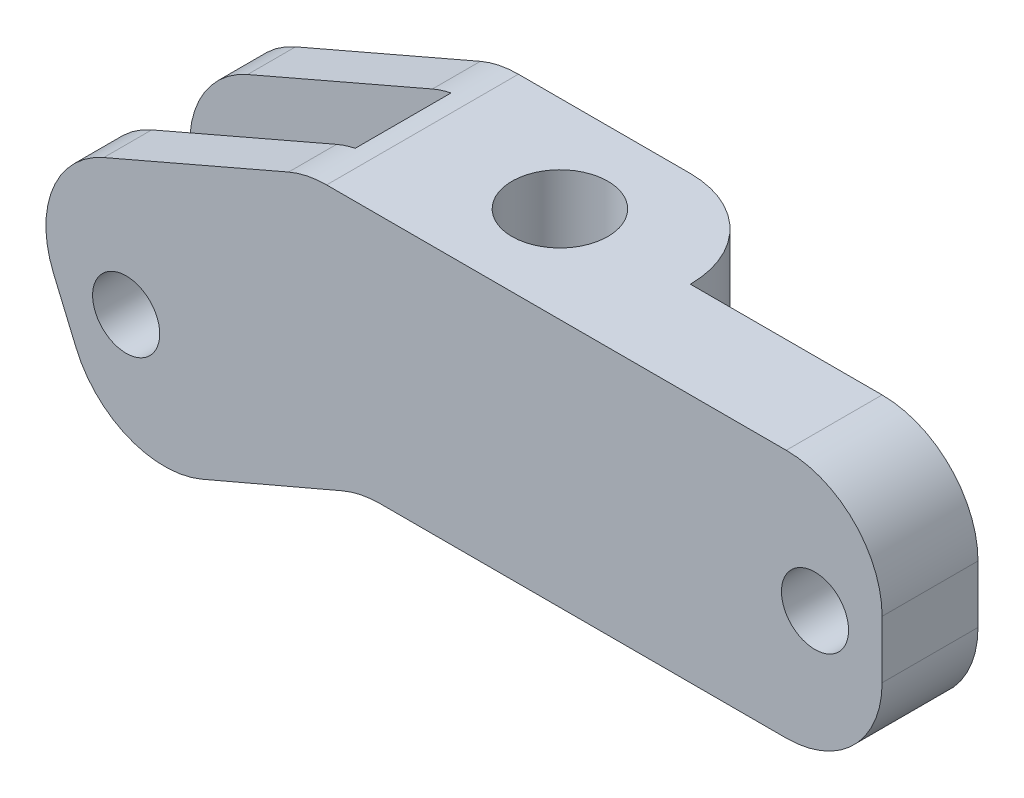
ISO-10303-21;
HEADER;
FILE_DESCRIPTION(('STEP AP214'),'2;1');
FILE_NAME('part.step','',(''),(''),'','','');
FILE_SCHEMA(('AUTOMOTIVE_DESIGN { 1 0 10303 214 1 1 1 1 }'));
ENDSEC;
DATA;
#1=APPLICATION_CONTEXT('core data for automotive mechanical design processes');
#2=APPLICATION_PROTOCOL_DEFINITION('international standard','automotive_design',2000,#1);
#3=PRODUCT_CONTEXT('',#1,'mechanical');
#4=PRODUCT('Part','Part','',(#3));
#5=PRODUCT_RELATED_PRODUCT_CATEGORY('part','',(#4));
#6=PRODUCT_DEFINITION_FORMATION('','',#4);
#7=PRODUCT_DEFINITION_CONTEXT('part definition',#1,'design');
#8=PRODUCT_DEFINITION('design','',#6,#7);
#9=PRODUCT_DEFINITION_SHAPE('','',#8);
#10=(LENGTH_UNIT() NAMED_UNIT(*) SI_UNIT(.MILLI.,.METRE.));
#11=(NAMED_UNIT(*) PLANE_ANGLE_UNIT() SI_UNIT($,.RADIAN.));
#12=(NAMED_UNIT(*) SI_UNIT($,.STERADIAN.) SOLID_ANGLE_UNIT());
#13=UNCERTAINTY_MEASURE_WITH_UNIT(LENGTH_MEASURE(1.E-05),#10,'distance_accuracy_value','');
#14=(GEOMETRIC_REPRESENTATION_CONTEXT(3) GLOBAL_UNCERTAINTY_ASSIGNED_CONTEXT((#13)) GLOBAL_UNIT_ASSIGNED_CONTEXT((#10,
#11,#12)) REPRESENTATION_CONTEXT('',''));
#15=CARTESIAN_POINT('',(0.,0.,0.));
#16=DIRECTION('',(0.,0.,1.));
#17=DIRECTION('',(1.,0.,0.));
#18=AXIS2_PLACEMENT_3D('',#15,#16,#17);
#19=CARTESIAN_POINT('',(-5.8701862452043,1.54429302734608,10.));
#20=DIRECTION('',(0.,0.,-1.));
#21=DIRECTION('',(-1.,0.,0.));
#22=AXIS2_PLACEMENT_3D('',#19,#20,#21);
#23=CYLINDRICAL_SURFACE('',#22,5.);
#24=DIRECTION('',(0.,0.,-1.));
#25=VECTOR('',#24,1.);
#26=CARTESIAN_POINT('',(-6.88194855886884,6.4408568246072,10.));
#27=LINE('',#26,#25);
#28=CARTESIAN_POINT('',(-6.88194855886884,6.4408568246072,7.5));
#29=VERTEX_POINT('',#28);
#30=CARTESIAN_POINT('',(-6.88194855886884,6.4408568246072,2.5));
#31=VERTEX_POINT('',#30);
#32=EDGE_CURVE('E354',#29,#31,#27,.T.);
#33=ORIENTED_EDGE('',*,*,#32,.F.);
#34=CARTESIAN_POINT('',(-5.8701862452043,1.54429302734608,7.5));
#35=DIRECTION('',(0.,0.,1.));
#36=DIRECTION('',(1.,0.,0.));
#37=AXIS2_PLACEMENT_3D('',#34,#35,#36);
#38=CIRCLE('',#37,5.);
#39=CARTESIAN_POINT('',(-7.85344478840631,6.1341389453281,7.5));
#40=VERTEX_POINT('',#39);
#41=EDGE_CURVE('E231',#40,#29,#38,.F.);
#42=ORIENTED_EDGE('',*,*,#41,.F.);
#43=DIRECTION('',(0.,0.,-1.));
#44=VECTOR('',#43,1.);
#45=CARTESIAN_POINT('',(-7.85344478840632,6.1341389453281,10.));
#46=LINE('',#45,#44);
#47=CARTESIAN_POINT('',(-7.85344478840632,6.1341389453281,10.));
#48=VERTEX_POINT('',#47);
#49=EDGE_CURVE('E343',#48,#40,#46,.T.);
#50=ORIENTED_EDGE('',*,*,#49,.F.);
#51=CARTESIAN_POINT('',(-5.8701862452043,1.54429302734608,10.));
#52=DIRECTION('',(0.,0.,-1.));
#53=DIRECTION('',(-1.,0.,0.));
#54=AXIS2_PLACEMENT_3D('',#51,#52,#53);
#55=CIRCLE('',#54,5.);
#56=CARTESIAN_POINT('',(-5.8701862452043,6.54429302734608,10.));
#57=VERTEX_POINT('',#56);
#58=EDGE_CURVE('E318',#57,#48,#55,.F.);
#59=ORIENTED_EDGE('',*,*,#58,.F.);
#60=DIRECTION('',(0.,0.,-1.));
#61=VECTOR('',#60,1.);
#62=CARTESIAN_POINT('',(-5.8701862452043,6.54429302734608,10.));
#63=LINE('',#62,#61);
#64=CARTESIAN_POINT('',(-5.8701862452043,6.54429302734608,0.));
#65=VERTEX_POINT('',#64);
#66=EDGE_CURVE('E337',#65,#57,#63,.F.);
#67=ORIENTED_EDGE('',*,*,#66,.F.);
#68=CARTESIAN_POINT('',(-5.8701862452043,1.54429302734608,0.));
#69=DIRECTION('',(0.,0.,-1.));
#70=DIRECTION('',(-1.,0.,0.));
#71=AXIS2_PLACEMENT_3D('',#68,#69,#70);
#72=CIRCLE('',#71,5.);
#73=CARTESIAN_POINT('',(-7.85344478840632,6.1341389453281,0.));
#74=VERTEX_POINT('',#73);
#75=EDGE_CURVE('E303',#74,#65,#72,.T.);
#76=ORIENTED_EDGE('',*,*,#75,.F.);
#77=CARTESIAN_POINT('',(-7.85344478840632,6.1341389453281,2.5));
#78=VERTEX_POINT('',#77);
#79=EDGE_CURVE('E342',#78,#74,#46,.T.);
#80=ORIENTED_EDGE('',*,*,#79,.F.);
#81=CARTESIAN_POINT('',(-5.8701862452043,1.54429302734608,2.5));
#82=DIRECTION('',(0.,0.,1.));
#83=DIRECTION('',(1.,0.,0.));
#84=AXIS2_PLACEMENT_3D('',#81,#82,#83);
#85=CIRCLE('',#84,5.);
#86=EDGE_CURVE('E356',#78,#31,#85,.F.);
#87=ORIENTED_EDGE('',*,*,#86,.T.);
#88=EDGE_LOOP('',(#33,#42,#50,#59,#67,#76,#80,#87));
#89=FACE_BOUND('',#88,.T.);
#90=ADVANCED_FACE('F35',(#89),#23,.T.);
#91=CARTESIAN_POINT('',(-6.9042271256126,6.54429302734608,10.));
#92=DIRECTION('',(0.396651708640403,-0.917969183596404,0.));
#93=DIRECTION('',(0.917969183596404,0.396651708640403,0.));
#94=AXIS2_PLACEMENT_3D('',#91,#92,#93);
#95=PLANE('',#94);
#96=DIRECTION('',(-0.917969183596404,-0.396651708640403,0.));
#97=VECTOR('',#96,1.);
#98=CARTESIAN_POINT('',(-22.0507186549533,-0.000460165220561928,2.5));
#99=LINE('',#98,#97);
#100=CARTESIAN_POINT('',(-17.4911673376097,1.96970817264501,2.5));
#101=VERTEX_POINT('',#100);
#102=EDGE_CURVE('E242',#78,#101,#99,.T.);
#103=ORIENTED_EDGE('',*,*,#102,.F.);
#104=ORIENTED_EDGE('',*,*,#79,.T.);
#105=DIRECTION('',(-0.917969183596404,-0.396651708640403,0.));
#106=VECTOR('',#105,1.);
#107=CARTESIAN_POINT('',(-6.9042271256126,6.54429302734608,0.));
#108=LINE('',#107,#106);
#109=CARTESIAN_POINT('',(-17.4911673376097,1.96970817264501,0.));
#110=VERTEX_POINT('',#109);
#111=EDGE_CURVE('E285',#74,#110,#108,.T.);
#112=ORIENTED_EDGE('',*,*,#111,.T.);
#113=DIRECTION('',(0.,0.,-1.));
#114=VECTOR('',#113,1.);
#115=CARTESIAN_POINT('',(-17.4911673376097,1.96970817264501,10.));
#116=LINE('',#115,#114);
#117=EDGE_CURVE('E347',#110,#101,#116,.F.);
#118=ORIENTED_EDGE('',*,*,#117,.T.);
#119=EDGE_LOOP('',(#103,#104,#112,#118));
#120=FACE_BOUND('',#119,.T.);
#121=ADVANCED_FACE('F432',(#120),#95,.F.);
#122=CARTESIAN_POINT('',(-22.0507186549533,-0.000460165220561928,10.));
#123=DIRECTION('',(0.920575736554109,0.390564096234998,0.));
#124=DIRECTION('',(-0.390564096234998,0.920575736554109,0.));
#125=AXIS2_PLACEMENT_3D('',#122,#123,#124);
#126=PLANE('',#125);
#127=DIRECTION('',(0.390564096234998,-0.920575736554108,0.));
#128=VECTOR('',#127,1.);
#129=CARTESIAN_POINT('',(-16.9733854038983,-11.967944740424,2.5));
#130=LINE('',#129,#128);
#131=CARTESIAN_POINT('',(-20.1107874771782,-4.57295822651201,2.5));
#132=VERTEX_POINT('',#131);
#133=CARTESIAN_POINT('',(-18.9329409445004,-7.34919124388369,2.5));
#134=VERTEX_POINT('',#133);
#135=EDGE_CURVE('E234',#132,#134,#130,.T.);
#136=ORIENTED_EDGE('',*,*,#135,.F.);
#137=DIRECTION('',(0.,0.,-1.));
#138=VECTOR('',#137,1.);
#139=CARTESIAN_POINT('',(-20.1107874771782,-4.572958226512,10.));
#140=LINE('',#139,#138);
#141=CARTESIAN_POINT('',(-20.1107874771782,-4.572958226512,0.));
#142=VERTEX_POINT('',#141);
#143=EDGE_CURVE('E310',#132,#142,#140,.T.);
#144=ORIENTED_EDGE('',*,*,#143,.T.);
#145=DIRECTION('',(0.390564096234998,-0.920575736554108,0.));
#146=VECTOR('',#145,1.);
#147=CARTESIAN_POINT('',(-22.0507186549533,-0.000460165220561928,0.));
#148=LINE('',#147,#146);
#149=CARTESIAN_POINT('',(-18.9329409445004,-7.34919124388369,0.));
#150=VERTEX_POINT('',#149);
#151=EDGE_CURVE('E288',#142,#150,#148,.T.);
#152=ORIENTED_EDGE('',*,*,#151,.T.);
#153=DIRECTION('',(0.,0.,-1.));
#154=VECTOR('',#153,1.);
#155=CARTESIAN_POINT('',(-18.9329409445004,-7.34919124388369,10.));
#156=LINE('',#155,#154);
#157=EDGE_CURVE('E315',#150,#134,#156,.F.);
#158=ORIENTED_EDGE('',*,*,#157,.T.);
#159=EDGE_LOOP('',(#136,#144,#152,#158));
#160=FACE_BOUND('',#159,.T.);
#161=ADVANCED_FACE('F436',(#160),#126,.F.);
#162=CARTESIAN_POINT('',(-4.1042271256126,-6.45570697265392,10.));
#163=DIRECTION('',(-0.393731269126432,0.919225591306122,0.));
#164=DIRECTION('',(-0.919225591306122,-0.393731269126432,0.));
#165=AXIS2_PLACEMENT_3D('',#162,#163,#164);
#166=PLANE('',#165);
#167=DIRECTION('',(0.919225591306122,0.393731269126432,0.));
#168=VECTOR('',#167,1.);
#169=CARTESIAN_POINT('',(-4.1042271256126,-6.45570697265392,2.5));
#170=LINE('',#169,#168);
#171=CARTESIAN_POINT('',(-12.3614059160977,-9.99249871923931,2.5));
#172=VERTEX_POINT('',#171);
#173=CARTESIAN_POINT('',(-5.04712789850232,-6.85957901612331,2.5));
#174=VERTEX_POINT('',#173);
#175=EDGE_CURVE('E238',#172,#174,#170,.T.);
#176=ORIENTED_EDGE('',*,*,#175,.F.);
#177=DIRECTION('',(0.,0.,-1.));
#178=VECTOR('',#177,1.);
#179=CARTESIAN_POINT('',(-12.3614059160977,-9.99249871923931,10.));
#180=LINE('',#179,#178);
#181=CARTESIAN_POINT('',(-12.3614059160977,-9.99249871923931,0.));
#182=VERTEX_POINT('',#181);
#183=EDGE_CURVE('E298',#172,#182,#180,.T.);
#184=ORIENTED_EDGE('',*,*,#183,.T.);
#185=DIRECTION('',(0.919225591306122,0.393731269126432,0.));
#186=VECTOR('',#185,1.);
#187=CARTESIAN_POINT('',(-4.1042271256126,-6.45570697265392,0.));
#188=LINE('',#187,#186);
#189=CARTESIAN_POINT('',(-5.04712789850232,-6.85957901612331,0.));
#190=VERTEX_POINT('',#189);
#191=EDGE_CURVE('E291',#182,#190,#188,.T.);
#192=ORIENTED_EDGE('',*,*,#191,.T.);
#193=DIRECTION('',(0.,0.,-1.));
#194=VECTOR('',#193,1.);
#195=CARTESIAN_POINT('',(-5.04712789850232,-6.85957901612331,10.));
#196=LINE('',#195,#194);
#197=EDGE_CURVE('E295',#190,#174,#196,.F.);
#198=ORIENTED_EDGE('',*,*,#197,.T.);
#199=EDGE_LOOP('',(#176,#184,#192,#198));
#200=FACE_BOUND('',#199,.T.);
#201=ADVANCED_FACE('F442',(#200),#166,.F.);
#202=CARTESIAN_POINT('',(-16.3238999645868,-4.53741159285459,10.));
#203=DIRECTION('',(0.,0.,-1.));
#204=DIRECTION('',(-1.,0.,0.));
#205=AXIS2_PLACEMENT_3D('',#202,#203,#204);
#206=CYLINDRICAL_SURFACE('',#205,1.75);
#207=CARTESIAN_POINT('',(-16.3238999645868,-4.53741159285459,0.));
#208=DIRECTION('',(0.,0.,1.));
#209=DIRECTION('',(1.,0.,0.));
#210=AXIS2_PLACEMENT_3D('',#207,#208,#209);
#211=CIRCLE('',#210,1.75);
#212=CARTESIAN_POINT('',(-14.5738999645868,-4.53741159285459,0.));
#213=VERTEX_POINT('',#212);
#214=EDGE_CURVE('E258',#213,#213,#211,.T.);
#215=ORIENTED_EDGE('',*,*,#214,.F.);
#216=EDGE_LOOP('',(#215));
#217=FACE_BOUND('',#216,.T.);
#218=CARTESIAN_POINT('',(-16.3238999645868,-4.53741159285459,2.5));
#219=DIRECTION('',(0.,0.,1.));
#220=DIRECTION('',(1.,0.,0.));
#221=AXIS2_PLACEMENT_3D('',#218,#219,#220);
#222=CIRCLE('',#221,1.75);
#223=CARTESIAN_POINT('',(-14.5738999645868,-4.53741159285459,2.5));
#224=VERTEX_POINT('',#223);
#225=EDGE_CURVE('E252',#224,#224,#222,.T.);
#226=ORIENTED_EDGE('',*,*,#225,.T.);
#227=EDGE_LOOP('',(#226));
#228=FACE_BOUND('',#227,.T.);
#229=ADVANCED_FACE('F573',(#217,#228),#206,.F.);
#230=CARTESIAN_POINT('',(-14.3300622617299,-5.3963707627087,10.));
#231=DIRECTION('',(0.,0.,-1.));
#232=DIRECTION('',(-1.,0.,0.));
#233=AXIS2_PLACEMENT_3D('',#230,#231,#232);
#234=CYLINDRICAL_SURFACE('',#233,5.);
#235=ORIENTED_EDGE('',*,*,#183,.F.);
#236=CARTESIAN_POINT('',(-14.3300622617299,-5.3963707627087,2.5));
#237=DIRECTION('',(0.,0.,1.));
#238=DIRECTION('',(1.,0.,0.));
#239=AXIS2_PLACEMENT_3D('',#236,#237,#238);
#240=CIRCLE('',#239,5.);
#241=EDGE_CURVE('E249',#172,#134,#240,.F.);
#242=ORIENTED_EDGE('',*,*,#241,.T.);
#243=ORIENTED_EDGE('',*,*,#157,.F.);
#244=CARTESIAN_POINT('',(-14.3300622617299,-5.3963707627087,0.));
#245=DIRECTION('',(0.,0.,-1.));
#246=DIRECTION('',(-1.,0.,0.));
#247=AXIS2_PLACEMENT_3D('',#244,#245,#246);
#248=CIRCLE('',#247,5.);
#249=EDGE_CURVE('E308',#182,#150,#248,.T.);
#250=ORIENTED_EDGE('',*,*,#249,.F.);
#251=EDGE_LOOP('',(#235,#242,#243,#250));
#252=FACE_BOUND('',#251,.T.);
#253=ADVANCED_FACE('F462',(#252),#234,.T.);
#254=CARTESIAN_POINT('',(-15.5079087944077,-2.62013774533702,10.));
#255=DIRECTION('',(0.,0.,-1.));
#256=DIRECTION('',(-1.,0.,0.));
#257=AXIS2_PLACEMENT_3D('',#254,#255,#256);
#258=CYLINDRICAL_SURFACE('',#257,5.);
#259=ORIENTED_EDGE('',*,*,#143,.F.);
#260=CARTESIAN_POINT('',(-15.5079087944077,-2.62013774533702,2.5));
#261=DIRECTION('',(0.,0.,1.));
#262=DIRECTION('',(1.,0.,0.));
#263=AXIS2_PLACEMENT_3D('',#260,#261,#262);
#264=CIRCLE('',#263,5.);
#265=EDGE_CURVE('E246',#132,#101,#264,.F.);
#266=ORIENTED_EDGE('',*,*,#265,.T.);
#267=ORIENTED_EDGE('',*,*,#117,.F.);
#268=CARTESIAN_POINT('',(-15.5079087944077,-2.62013774533702,0.));
#269=DIRECTION('',(0.,0.,-1.));
#270=DIRECTION('',(-1.,0.,0.));
#271=AXIS2_PLACEMENT_3D('',#268,#269,#270);
#272=CIRCLE('',#271,5.);
#273=EDGE_CURVE('E306',#142,#110,#272,.T.);
#274=ORIENTED_EDGE('',*,*,#273,.F.);
#275=EDGE_LOOP('',(#259,#266,#267,#274));
#276=FACE_BOUND('',#275,.T.);
#277=ADVANCED_FACE('F429',(#276),#258,.T.);
#278=CARTESIAN_POINT('',(0.,0.,10.));
#279=DIRECTION('',(0.,0.,-1.));
#280=DIRECTION('',(-1.,0.,0.));
#281=AXIS2_PLACEMENT_3D('',#278,#279,#280);
#282=PLANE('',#281);
#283=DIRECTION('',(0.390564096234998,-0.920575736554108,0.));
#284=VECTOR('',#283,1.);
#285=CARTESIAN_POINT('',(-22.0507186549533,-0.000460165220561928,10.));
#286=LINE('',#285,#284);
#287=CARTESIAN_POINT('',(-20.1107874771782,-4.572958226512,10.));
#288=VERTEX_POINT('',#287);
#289=CARTESIAN_POINT('',(-18.9329409445004,-7.34919124388369,10.));
#290=VERTEX_POINT('',#289);
#291=EDGE_CURVE('E274',#288,#290,#286,.T.);
#292=ORIENTED_EDGE('',*,*,#291,.T.);
#293=CARTESIAN_POINT('',(-14.3300622617299,-5.3963707627087,10.));
#294=DIRECTION('',(0.,0.,-1.));
#295=DIRECTION('',(-1.,0.,0.));
#296=AXIS2_PLACEMENT_3D('',#293,#294,#295);
#297=CIRCLE('',#296,5.);
#298=CARTESIAN_POINT('',(-12.3614059160977,-9.99249871923931,10.));
#299=VERTEX_POINT('',#298);
#300=EDGE_CURVE('E326',#290,#299,#297,.F.);
#301=ORIENTED_EDGE('',*,*,#300,.T.);
#302=DIRECTION('',(0.919225591306122,0.393731269126432,0.));
#303=VECTOR('',#302,1.);
#304=CARTESIAN_POINT('',(-4.1042271256126,-6.45570697265392,10.));
#305=LINE('',#304,#303);
#306=CARTESIAN_POINT('',(-5.04712789850232,-6.85957901612331,10.));
#307=VERTEX_POINT('',#306);
#308=EDGE_CURVE('E277',#299,#307,#305,.T.);
#309=ORIENTED_EDGE('',*,*,#308,.T.);
#310=CARTESIAN_POINT('',(-3.07847155287016,-11.4557069726539,10.));
#311=DIRECTION('',(0.,0.,-1.));
#312=DIRECTION('',(-1.,0.,0.));
#313=AXIS2_PLACEMENT_3D('',#310,#311,#312);
#314=CIRCLE('',#313,5.);
#315=CARTESIAN_POINT('',(-3.07847155287016,-6.45570697265392,10.));
#316=VERTEX_POINT('',#315);
#317=EDGE_CURVE('E352',#307,#316,#314,.T.);
#318=ORIENTED_EDGE('',*,*,#317,.T.);
#319=DIRECTION('',(1.,0.,0.));
#320=VECTOR('',#319,1.);
#321=CARTESIAN_POINT('',(-4.1042271256126,-6.45570697265392,10.));
#322=LINE('',#321,#320);
#323=CARTESIAN_POINT('',(18.0957728743874,-6.45570697265392,10.));
#324=VERTEX_POINT('',#323);
#325=EDGE_CURVE('E280',#316,#324,#322,.T.);
#326=ORIENTED_EDGE('',*,*,#325,.T.);
#327=CARTESIAN_POINT('',(18.0957728743874,-1.45570697265392,10.));
#328=DIRECTION('',(0.,0.,-1.));
#329=DIRECTION('',(-1.,0.,0.));
#330=AXIS2_PLACEMENT_3D('',#327,#328,#329);
#331=CIRCLE('',#330,5.);
#332=CARTESIAN_POINT('',(23.0957728743874,-1.45570697265392,10.));
#333=VERTEX_POINT('',#332);
#334=EDGE_CURVE('E324',#324,#333,#331,.F.);
#335=ORIENTED_EDGE('',*,*,#334,.T.);
#336=DIRECTION('',(0.,1.,0.));
#337=VECTOR('',#336,1.);
#338=CARTESIAN_POINT('',(23.0957728743874,-6.45570697265392,10.));
#339=LINE('',#338,#337);
#340=CARTESIAN_POINT('',(23.0957728743874,1.54429302734608,10.));
#341=VERTEX_POINT('',#340);
#342=EDGE_CURVE('E265',#333,#341,#339,.T.);
#343=ORIENTED_EDGE('',*,*,#342,.T.);
#344=CARTESIAN_POINT('',(18.0957728743874,1.54429302734608,10.));
#345=DIRECTION('',(0.,0.,-1.));
#346=DIRECTION('',(-1.,0.,0.));
#347=AXIS2_PLACEMENT_3D('',#344,#345,#346);
#348=CIRCLE('',#347,5.);
#349=CARTESIAN_POINT('',(18.0957728743874,6.54429302734608,10.));
#350=VERTEX_POINT('',#349);
#351=EDGE_CURVE('E322',#341,#350,#348,.F.);
#352=ORIENTED_EDGE('',*,*,#351,.T.);
#353=DIRECTION('',(-1.,0.,0.));
#354=VECTOR('',#353,1.);
#355=CARTESIAN_POINT('',(-6.9042271256126,6.54429302734608,10.));
#356=LINE('',#355,#354);
#357=EDGE_CURVE('E268',#350,#57,#356,.T.);
#358=ORIENTED_EDGE('',*,*,#357,.T.);
#359=ORIENTED_EDGE('',*,*,#58,.T.);
#360=DIRECTION('',(-0.917969183596404,-0.396651708640403,0.));
#361=VECTOR('',#360,1.);
#362=CARTESIAN_POINT('',(-6.9042271256126,6.54429302734608,10.));
#363=LINE('',#362,#361);
#364=CARTESIAN_POINT('',(-17.4911673376097,1.96970817264501,10.));
#365=VERTEX_POINT('',#364);
#366=EDGE_CURVE('E271',#48,#365,#363,.T.);
#367=ORIENTED_EDGE('',*,*,#366,.T.);
#368=CARTESIAN_POINT('',(-15.5079087944077,-2.62013774533702,10.));
#369=DIRECTION('',(0.,0.,-1.));
#370=DIRECTION('',(-1.,0.,0.));
#371=AXIS2_PLACEMENT_3D('',#368,#369,#370);
#372=CIRCLE('',#371,5.);
#373=EDGE_CURVE('E320',#365,#288,#372,.F.);
#374=ORIENTED_EDGE('',*,*,#373,.T.);
#375=EDGE_LOOP('',(#292,#301,#309,#318,#326,#335,#343,#352,#358,#359,#367,#374));
#376=FACE_BOUND('',#375,.T.);
#377=CARTESIAN_POINT('',(-16.3238999645868,-4.53741159285459,10.));
#378=DIRECTION('',(0.,0.,1.));
#379=DIRECTION('',(1.,0.,0.));
#380=AXIS2_PLACEMENT_3D('',#377,#378,#379);
#381=CIRCLE('',#380,1.75);
#382=CARTESIAN_POINT('',(-14.5738999645868,-4.53741159285459,10.));
#383=VERTEX_POINT('',#382);
#384=EDGE_CURVE('E259',#383,#383,#381,.T.);
#385=ORIENTED_EDGE('',*,*,#384,.F.);
#386=EDGE_LOOP('',(#385));
#387=FACE_BOUND('',#386,.T.);
#388=CARTESIAN_POINT('',(19.5957728743874,0.0442930273460776,10.));
#389=DIRECTION('',(0.,0.,1.));
#390=DIRECTION('',(1.,0.,0.));
#391=AXIS2_PLACEMENT_3D('',#388,#389,#390);
#392=CIRCLE('',#391,1.75);
#393=CARTESIAN_POINT('',(21.3457728743874,0.0442930273460776,10.));
#394=VERTEX_POINT('',#393);
#395=EDGE_CURVE('E255',#394,#394,#392,.T.);
#396=ORIENTED_EDGE('',*,*,#395,.F.);
#397=EDGE_LOOP('',(#396));
#398=FACE_BOUND('',#397,.T.);
#399=ADVANCED_FACE('F375',(#376,#387,#398),#282,.F.);
#400=CARTESIAN_POINT('',(0.,0.,0.));
#401=DIRECTION('',(0.,0.,-1.));
#402=DIRECTION('',(-1.,0.,0.));
#403=AXIS2_PLACEMENT_3D('',#400,#401,#402);
#404=PLANE('',#403);
#405=DIRECTION('',(-1.,0.,0.));
#406=VECTOR('',#405,1.);
#407=CARTESIAN_POINT('',(-6.9042271256126,6.54429302734608,0.));
#408=LINE('',#407,#406);
#409=CARTESIAN_POINT('',(3.0957728743874,6.54429302734608,0.));
#410=VERTEX_POINT('',#409);
#411=EDGE_CURVE('E262',#410,#65,#408,.T.);
#412=ORIENTED_EDGE('',*,*,#411,.F.);
#413=DIRECTION('',(0.,-1.,0.));
#414=VECTOR('',#413,1.);
#415=CARTESIAN_POINT('',(3.0957728743874,-6.45570697265392,0.));
#416=LINE('',#415,#414);
#417=CARTESIAN_POINT('',(3.0957728743874,-6.45570697265392,0.));
#418=VERTEX_POINT('',#417);
#419=EDGE_CURVE('E190',#410,#418,#416,.T.);
#420=ORIENTED_EDGE('',*,*,#419,.T.);
#421=DIRECTION('',(1.,0.,0.));
#422=VECTOR('',#421,1.);
#423=CARTESIAN_POINT('',(-4.1042271256126,-6.45570697265392,0.));
#424=LINE('',#423,#422);
#425=CARTESIAN_POINT('',(-3.07847155287016,-6.45570697265392,0.));
#426=VERTEX_POINT('',#425);
#427=EDGE_CURVE('E189',#426,#418,#424,.T.);
#428=ORIENTED_EDGE('',*,*,#427,.F.);
#429=CARTESIAN_POINT('',(-3.07847155287016,-11.4557069726539,0.));
#430=DIRECTION('',(0.,0.,-1.));
#431=DIRECTION('',(-1.,0.,0.));
#432=AXIS2_PLACEMENT_3D('',#429,#430,#431);
#433=CIRCLE('',#432,5.);
#434=EDGE_CURVE('E350',#426,#190,#433,.F.);
#435=ORIENTED_EDGE('',*,*,#434,.T.);
#436=ORIENTED_EDGE('',*,*,#191,.F.);
#437=ORIENTED_EDGE('',*,*,#249,.T.);
#438=ORIENTED_EDGE('',*,*,#151,.F.);
#439=ORIENTED_EDGE('',*,*,#273,.T.);
#440=ORIENTED_EDGE('',*,*,#111,.F.);
#441=ORIENTED_EDGE('',*,*,#75,.T.);
#442=EDGE_LOOP('',(#412,#420,#428,#435,#436,#437,#438,#439,#440,#441));
#443=FACE_BOUND('',#442,.T.);
#444=ORIENTED_EDGE('',*,*,#214,.T.);
#445=EDGE_LOOP('',(#444));
#446=FACE_BOUND('',#445,.T.);
#447=ADVANCED_FACE('F364',(#443,#446),#404,.T.);
#448=CARTESIAN_POINT('',(23.0957728743874,-6.45570697265392,10.));
#449=DIRECTION('',(-1.,0.,0.));
#450=DIRECTION('',(0.,0.,1.));
#451=AXIS2_PLACEMENT_3D('',#448,#449,#450);
#452=PLANE('',#451);
#453=DIRECTION('',(0.,0.,-1.));
#454=VECTOR('',#453,1.);
#455=CARTESIAN_POINT('',(23.0957728743874,-1.45570697265392,10.));
#456=LINE('',#455,#454);
#457=CARTESIAN_POINT('',(23.0957728743874,-1.45570697265392,5.));
#458=VERTEX_POINT('',#457);
#459=EDGE_CURVE('E334',#333,#458,#456,.T.);
#460=ORIENTED_EDGE('',*,*,#459,.T.);
#461=DIRECTION('',(0.,1.,0.));
#462=VECTOR('',#461,1.);
#463=CARTESIAN_POINT('',(23.0957728743874,-6.45570697265392,5.));
#464=LINE('',#463,#462);
#465=CARTESIAN_POINT('',(23.0957728743874,1.54429302734608,5.));
#466=VERTEX_POINT('',#465);
#467=EDGE_CURVE('E206',#458,#466,#464,.T.);
#468=ORIENTED_EDGE('',*,*,#467,.T.);
#469=DIRECTION('',(0.,0.,-1.));
#470=VECTOR('',#469,1.);
#471=CARTESIAN_POINT('',(23.0957728743874,1.54429302734608,10.));
#472=LINE('',#471,#470);
#473=EDGE_CURVE('E332',#466,#341,#472,.F.);
#474=ORIENTED_EDGE('',*,*,#473,.T.);
#475=ORIENTED_EDGE('',*,*,#342,.F.);
#476=EDGE_LOOP('',(#460,#468,#474,#475));
#477=FACE_BOUND('',#476,.T.);
#478=ADVANCED_FACE('F416',(#477),#452,.F.);
#479=CARTESIAN_POINT('',(-6.9042271256126,6.54429302734608,10.));
#480=DIRECTION('',(0.,-1.,0.));
#481=DIRECTION('',(0.,0.,-1.));
#482=AXIS2_PLACEMENT_3D('',#479,#480,#481);
#483=PLANE('',#482);
#484=CARTESIAN_POINT('',(1.29393203998987,6.54429302734608,5.));
#485=DIRECTION('',(0.,1.,0.));
#486=DIRECTION('',(0.,0.,1.));
#487=AXIS2_PLACEMENT_3D('',#484,#485,#486);
#488=CIRCLE('',#487,2.5);
#489=CARTESIAN_POINT('',(1.29393203998987,6.54429302734608,7.5));
#490=VERTEX_POINT('',#489);
#491=EDGE_CURVE('E201',#490,#490,#488,.T.);
#492=ORIENTED_EDGE('',*,*,#491,.F.);
#493=EDGE_LOOP('',(#492));
#494=FACE_BOUND('',#493,.T.);
#495=DIRECTION('',(-1.,0.,0.));
#496=VECTOR('',#495,1.);
#497=CARTESIAN_POINT('',(-6.9042271256126,6.54429302734608,5.));
#498=LINE('',#497,#496);
#499=CARTESIAN_POINT('',(18.0957728743874,6.54429302734608,5.));
#500=VERTEX_POINT('',#499);
#501=CARTESIAN_POINT('',(8.0957728743874,6.54429302734608,5.));
#502=VERTEX_POINT('',#501);
#503=EDGE_CURVE('E196',#500,#502,#498,.T.);
#504=ORIENTED_EDGE('',*,*,#503,.T.);
#505=CARTESIAN_POINT('',(3.0957728743874,6.54429302734608,5.));
#506=DIRECTION('',(0.,-1.,0.));
#507=DIRECTION('',(0.,0.,-1.));
#508=AXIS2_PLACEMENT_3D('',#505,#506,#507);
#509=CIRCLE('',#508,5.);
#510=EDGE_CURVE('E11',#502,#410,#509,.F.);
#511=ORIENTED_EDGE('',*,*,#510,.T.);
#512=ORIENTED_EDGE('',*,*,#411,.T.);
#513=ORIENTED_EDGE('',*,*,#66,.T.);
#514=ORIENTED_EDGE('',*,*,#357,.F.);
#515=DIRECTION('',(0.,0.,-1.));
#516=VECTOR('',#515,1.);
#517=CARTESIAN_POINT('',(18.0957728743874,6.54429302734608,10.));
#518=LINE('',#517,#516);
#519=EDGE_CURVE('E339',#350,#500,#518,.T.);
#520=ORIENTED_EDGE('',*,*,#519,.T.);
#521=EDGE_LOOP('',(#504,#511,#512,#513,#514,#520));
#522=FACE_BOUND('',#521,.T.);
#523=ADVANCED_FACE('F369',(#494,#522),#483,.F.);
#524=ORIENTED_EDGE('',*,*,#49,.T.);
#525=DIRECTION('',(-0.917969183596404,-0.396651708640403,0.));
#526=VECTOR('',#525,1.);
#527=CARTESIAN_POINT('',(-22.0507186549533,-0.000460165220561928,7.5));
#528=LINE('',#527,#526);
#529=CARTESIAN_POINT('',(-17.4911673376097,1.96970817264501,7.5));
#530=VERTEX_POINT('',#529);
#531=EDGE_CURVE('E223',#40,#530,#528,.T.);
#532=ORIENTED_EDGE('',*,*,#531,.T.);
#533=EDGE_CURVE('E346',#530,#365,#116,.F.);
#534=ORIENTED_EDGE('',*,*,#533,.T.);
#535=ORIENTED_EDGE('',*,*,#366,.F.);
#536=EDGE_LOOP('',(#524,#532,#534,#535));
#537=FACE_BOUND('',#536,.T.);
#538=ADVANCED_FACE('F382',(#537),#95,.F.);
#539=CARTESIAN_POINT('',(-20.1107874771782,-4.57295822651201,7.5));
#540=VERTEX_POINT('',#539);
#541=EDGE_CURVE('E311',#288,#540,#140,.T.);
#542=ORIENTED_EDGE('',*,*,#541,.T.);
#543=DIRECTION('',(0.390564096234998,-0.920575736554108,0.));
#544=VECTOR('',#543,1.);
#545=CARTESIAN_POINT('',(-16.9733854038983,-11.967944740424,7.5));
#546=LINE('',#545,#544);
#547=CARTESIAN_POINT('',(-18.9329409445004,-7.34919124388369,7.5));
#548=VERTEX_POINT('',#547);
#549=EDGE_CURVE('E213',#540,#548,#546,.T.);
#550=ORIENTED_EDGE('',*,*,#549,.T.);
#551=EDGE_CURVE('E314',#548,#290,#156,.F.);
#552=ORIENTED_EDGE('',*,*,#551,.T.);
#553=ORIENTED_EDGE('',*,*,#291,.F.);
#554=EDGE_LOOP('',(#542,#550,#552,#553));
#555=FACE_BOUND('',#554,.T.);
#556=ADVANCED_FACE('F391',(#555),#126,.F.);
#557=CARTESIAN_POINT('',(-12.3614059160977,-9.99249871923931,7.5));
#558=VERTEX_POINT('',#557);
#559=EDGE_CURVE('E300',#299,#558,#180,.T.);
#560=ORIENTED_EDGE('',*,*,#559,.T.);
#561=DIRECTION('',(0.919225591306122,0.393731269126432,0.));
#562=VECTOR('',#561,1.);
#563=CARTESIAN_POINT('',(-4.1042271256126,-6.45570697265392,7.5));
#564=LINE('',#563,#562);
#565=CARTESIAN_POINT('',(-5.04712789850232,-6.85957901612331,7.5));
#566=VERTEX_POINT('',#565);
#567=EDGE_CURVE('E219',#558,#566,#564,.T.);
#568=ORIENTED_EDGE('',*,*,#567,.T.);
#569=EDGE_CURVE('E283',#566,#307,#196,.F.);
#570=ORIENTED_EDGE('',*,*,#569,.T.);
#571=ORIENTED_EDGE('',*,*,#308,.F.);
#572=EDGE_LOOP('',(#560,#568,#570,#571));
#573=FACE_BOUND('',#572,.T.);
#574=ADVANCED_FACE('F401',(#573),#166,.F.);
#575=CARTESIAN_POINT('',(-4.1042271256126,-6.45570697265392,10.));
#576=DIRECTION('',(0.,1.,0.));
#577=DIRECTION('',(0.,0.,1.));
#578=AXIS2_PLACEMENT_3D('',#575,#576,#577);
#579=PLANE('',#578);
#580=ORIENTED_EDGE('',*,*,#427,.T.);
#581=CARTESIAN_POINT('',(3.0957728743874,-6.45570697265392,5.));
#582=DIRECTION('',(0.,1.,0.));
#583=DIRECTION('',(0.,0.,1.));
#584=AXIS2_PLACEMENT_3D('',#581,#582,#583);
#585=CIRCLE('',#584,5.);
#586=CARTESIAN_POINT('',(8.0957728743874,-6.45570697265392,5.));
#587=VERTEX_POINT('',#586);
#588=EDGE_CURVE('E43',#418,#587,#585,.F.);
#589=ORIENTED_EDGE('',*,*,#588,.T.);
#590=DIRECTION('',(1.,0.,0.));
#591=VECTOR('',#590,1.);
#592=CARTESIAN_POINT('',(23.0957728743874,-6.45570697265392,5.));
#593=LINE('',#592,#591);
#594=CARTESIAN_POINT('',(18.0957728743874,-6.45570697265392,5.));
#595=VERTEX_POINT('',#594);
#596=EDGE_CURVE('E185',#587,#595,#593,.T.);
#597=ORIENTED_EDGE('',*,*,#596,.T.);
#598=DIRECTION('',(0.,0.,-1.));
#599=VECTOR('',#598,1.);
#600=CARTESIAN_POINT('',(18.0957728743874,-6.45570697265392,10.));
#601=LINE('',#600,#599);
#602=EDGE_CURVE('E328',#595,#324,#601,.F.);
#603=ORIENTED_EDGE('',*,*,#602,.T.);
#604=ORIENTED_EDGE('',*,*,#325,.F.);
#605=DIRECTION('',(0.,0.,-1.));
#606=VECTOR('',#605,1.);
#607=CARTESIAN_POINT('',(-3.07847155287016,-6.45570697265392,0.));
#608=LINE('',#607,#606);
#609=EDGE_CURVE('E330',#316,#426,#608,.T.);
#610=ORIENTED_EDGE('',*,*,#609,.T.);
#611=EDGE_LOOP('',(#580,#589,#597,#603,#604,#610));
#612=FACE_BOUND('',#611,.T.);
#613=ADVANCED_FACE('F184',(#612),#579,.F.);
#614=CARTESIAN_POINT('',(-16.3238999645868,-4.53741159285459,7.5));
#615=DIRECTION('',(0.,0.,1.));
#616=DIRECTION('',(1.,0.,0.));
#617=AXIS2_PLACEMENT_3D('',#614,#615,#616);
#618=CIRCLE('',#617,1.75);
#619=CARTESIAN_POINT('',(-14.5738999645868,-4.53741159285459,7.5));
#620=VERTEX_POINT('',#619);
#621=EDGE_CURVE('E228',#620,#620,#618,.T.);
#622=ORIENTED_EDGE('',*,*,#621,.F.);
#623=EDGE_LOOP('',(#622));
#624=FACE_BOUND('',#623,.T.);
#625=ORIENTED_EDGE('',*,*,#384,.T.);
#626=EDGE_LOOP('',(#625));
#627=FACE_BOUND('',#626,.T.);
#628=ADVANCED_FACE('F503',(#624,#627),#206,.F.);
#629=CARTESIAN_POINT('',(19.5957728743874,0.0442930273460776,10.));
#630=DIRECTION('',(0.,0.,-1.));
#631=DIRECTION('',(-1.,0.,0.));
#632=AXIS2_PLACEMENT_3D('',#629,#630,#631);
#633=CYLINDRICAL_SURFACE('',#632,1.75);
#634=CARTESIAN_POINT('',(19.5957728743874,0.0442930273460776,5.));
#635=DIRECTION('',(0.,0.,1.));
#636=DIRECTION('',(1.,0.,0.));
#637=AXIS2_PLACEMENT_3D('',#634,#635,#636);
#638=CIRCLE('',#637,1.75);
#639=CARTESIAN_POINT('',(21.3457728743874,0.0442930273460776,5.));
#640=VERTEX_POINT('',#639);
#641=EDGE_CURVE('E210',#640,#640,#638,.T.);
#642=ORIENTED_EDGE('',*,*,#641,.F.);
#643=EDGE_LOOP('',(#642));
#644=FACE_BOUND('',#643,.T.);
#645=ORIENTED_EDGE('',*,*,#395,.T.);
#646=EDGE_LOOP('',(#645));
#647=FACE_BOUND('',#646,.T.);
#648=ADVANCED_FACE('F461',(#644,#647),#633,.F.);
#649=CARTESIAN_POINT('',(-14.3300622617299,-5.3963707627087,7.5));
#650=DIRECTION('',(0.,0.,1.));
#651=DIRECTION('',(1.,0.,0.));
#652=AXIS2_PLACEMENT_3D('',#649,#650,#651);
#653=CIRCLE('',#652,5.);
#654=EDGE_CURVE('E226',#558,#548,#653,.F.);
#655=ORIENTED_EDGE('',*,*,#654,.F.);
#656=ORIENTED_EDGE('',*,*,#559,.F.);
#657=ORIENTED_EDGE('',*,*,#300,.F.);
#658=ORIENTED_EDGE('',*,*,#551,.F.);
#659=EDGE_LOOP('',(#655,#656,#657,#658));
#660=FACE_BOUND('',#659,.T.);
#661=ADVANCED_FACE('F398',(#660),#234,.T.);
#662=CARTESIAN_POINT('',(-3.07847155287016,-11.4557069726539,10.));
#663=DIRECTION('',(0.,0.,1.));
#664=DIRECTION('',(1.,0.,0.));
#665=AXIS2_PLACEMENT_3D('',#662,#663,#664);
#666=CYLINDRICAL_SURFACE('',#665,5.);
#667=ORIENTED_EDGE('',*,*,#317,.F.);
#668=ORIENTED_EDGE('',*,*,#569,.F.);
#669=EDGE_CURVE('E299',#174,#566,#196,.F.);
#670=ORIENTED_EDGE('',*,*,#669,.F.);
#671=ORIENTED_EDGE('',*,*,#197,.F.);
#672=ORIENTED_EDGE('',*,*,#434,.F.);
#673=ORIENTED_EDGE('',*,*,#609,.F.);
#674=EDGE_LOOP('',(#667,#668,#670,#671,#672,#673));
#675=FACE_BOUND('',#674,.T.);
#676=ADVANCED_FACE('F407',(#675),#666,.F.);
#677=CARTESIAN_POINT('',(18.0957728743874,-1.45570697265392,10.));
#678=DIRECTION('',(0.,0.,-1.));
#679=DIRECTION('',(-1.,0.,0.));
#680=AXIS2_PLACEMENT_3D('',#677,#678,#679);
#681=CYLINDRICAL_SURFACE('',#680,5.);
#682=CARTESIAN_POINT('',(18.0957728743874,-1.45570697265392,5.));
#683=DIRECTION('',(0.,0.,1.));
#684=DIRECTION('',(1.,0.,0.));
#685=AXIS2_PLACEMENT_3D('',#682,#683,#684);
#686=CIRCLE('',#685,5.);
#687=EDGE_CURVE('E195',#458,#595,#686,.F.);
#688=ORIENTED_EDGE('',*,*,#687,.F.);
#689=ORIENTED_EDGE('',*,*,#459,.F.);
#690=ORIENTED_EDGE('',*,*,#334,.F.);
#691=ORIENTED_EDGE('',*,*,#602,.F.);
#692=EDGE_LOOP('',(#688,#689,#690,#691));
#693=FACE_BOUND('',#692,.T.);
#694=ADVANCED_FACE('F414',(#693),#681,.T.);
#695=CARTESIAN_POINT('',(18.0957728743874,1.54429302734608,10.));
#696=DIRECTION('',(0.,0.,-1.));
#697=DIRECTION('',(-1.,0.,0.));
#698=AXIS2_PLACEMENT_3D('',#695,#696,#697);
#699=CYLINDRICAL_SURFACE('',#698,5.);
#700=CARTESIAN_POINT('',(18.0957728743874,1.54429302734608,5.));
#701=DIRECTION('',(0.,0.,1.));
#702=DIRECTION('',(1.,0.,0.));
#703=AXIS2_PLACEMENT_3D('',#700,#701,#702);
#704=CIRCLE('',#703,5.);
#705=EDGE_CURVE('E361',#500,#466,#704,.F.);
#706=ORIENTED_EDGE('',*,*,#705,.F.);
#707=ORIENTED_EDGE('',*,*,#519,.F.);
#708=ORIENTED_EDGE('',*,*,#351,.F.);
#709=ORIENTED_EDGE('',*,*,#473,.F.);
#710=EDGE_LOOP('',(#706,#707,#708,#709));
#711=FACE_BOUND('',#710,.T.);
#712=ADVANCED_FACE('F420',(#711),#699,.T.);
#713=CARTESIAN_POINT('',(-15.5079087944077,-2.62013774533702,7.5));
#714=DIRECTION('',(0.,0.,1.));
#715=DIRECTION('',(1.,0.,0.));
#716=AXIS2_PLACEMENT_3D('',#713,#714,#715);
#717=CIRCLE('',#716,5.);
#718=EDGE_CURVE('E359',#540,#530,#717,.F.);
#719=ORIENTED_EDGE('',*,*,#718,.F.);
#720=ORIENTED_EDGE('',*,*,#541,.F.);
#721=ORIENTED_EDGE('',*,*,#373,.F.);
#722=ORIENTED_EDGE('',*,*,#533,.F.);
#723=EDGE_LOOP('',(#719,#720,#721,#722));
#724=FACE_BOUND('',#723,.T.);
#725=ADVANCED_FACE('F389',(#724),#258,.T.);
#726=CARTESIAN_POINT('',(-4.1042271256126,-6.45570697265392,2.5));
#727=DIRECTION('',(0.393731269126432,-0.919225591306122,0.));
#728=DIRECTION('',(0.919225591306122,0.393731269126432,0.));
#729=AXIS2_PLACEMENT_3D('',#726,#727,#728);
#730=PLANE('',#729);
#731=ORIENTED_EDGE('',*,*,#669,.T.);
#732=CARTESIAN_POINT('',(-4.1042271256126,-6.45570697265392,7.5));
#733=VERTEX_POINT('',#732);
#734=EDGE_CURVE('E216',#566,#733,#564,.T.);
#735=ORIENTED_EDGE('',*,*,#734,.T.);
#736=DIRECTION('',(0.,0.,1.));
#737=VECTOR('',#736,1.);
#738=CARTESIAN_POINT('',(-4.1042271256126,-6.45570697265392,2.5));
#739=LINE('',#738,#737);
#740=CARTESIAN_POINT('',(-4.1042271256126,-6.45570697265392,2.5));
#741=VERTEX_POINT('',#740);
#742=EDGE_CURVE('E244',#741,#733,#739,.T.);
#743=ORIENTED_EDGE('',*,*,#742,.F.);
#744=EDGE_CURVE('E236',#174,#741,#170,.T.);
#745=ORIENTED_EDGE('',*,*,#744,.F.);
#746=EDGE_LOOP('',(#731,#735,#743,#745));
#747=FACE_BOUND('',#746,.T.);
#748=ADVANCED_FACE('F427',(#747),#730,.F.);
#749=CARTESIAN_POINT('',(-6.9042271256126,6.54429302734608,2.5));
#750=DIRECTION('',(0.977581781173629,0.210556075945089,0.));
#751=DIRECTION('',(-0.210556075945089,0.977581781173629,0.));
#752=AXIS2_PLACEMENT_3D('',#749,#750,#751);
#753=PLANE('',#752);
#754=ORIENTED_EDGE('',*,*,#32,.T.);
#755=DIRECTION('',(-0.210556075945089,0.977581781173629,0.));
#756=VECTOR('',#755,1.);
#757=CARTESIAN_POINT('',(-6.9042271256126,6.54429302734608,2.5));
#758=LINE('',#757,#756);
#759=EDGE_CURVE('E239',#741,#31,#758,.T.);
#760=ORIENTED_EDGE('',*,*,#759,.F.);
#761=ORIENTED_EDGE('',*,*,#742,.T.);
#762=DIRECTION('',(-0.210556075945089,0.977581781173629,0.));
#763=VECTOR('',#762,1.);
#764=CARTESIAN_POINT('',(-6.9042271256126,6.54429302734608,7.5));
#765=LINE('',#764,#763);
#766=EDGE_CURVE('E220',#733,#29,#765,.T.);
#767=ORIENTED_EDGE('',*,*,#766,.T.);
#768=EDGE_LOOP('',(#754,#760,#761,#767));
#769=FACE_BOUND('',#768,.T.);
#770=ADVANCED_FACE('F561',(#769),#753,.F.);
#771=CARTESIAN_POINT('',(0.,0.,2.5));
#772=DIRECTION('',(0.,0.,1.));
#773=DIRECTION('',(1.,0.,0.));
#774=AXIS2_PLACEMENT_3D('',#771,#772,#773);
#775=PLANE('',#774);
#776=ORIENTED_EDGE('',*,*,#225,.F.);
#777=EDGE_LOOP('',(#776));
#778=FACE_BOUND('',#777,.T.);
#779=ORIENTED_EDGE('',*,*,#175,.T.);
#780=ORIENTED_EDGE('',*,*,#744,.T.);
#781=ORIENTED_EDGE('',*,*,#759,.T.);
#782=ORIENTED_EDGE('',*,*,#86,.F.);
#783=ORIENTED_EDGE('',*,*,#102,.T.);
#784=ORIENTED_EDGE('',*,*,#265,.F.);
#785=ORIENTED_EDGE('',*,*,#135,.T.);
#786=ORIENTED_EDGE('',*,*,#241,.F.);
#787=EDGE_LOOP('',(#779,#780,#781,#782,#783,#784,#785,#786));
#788=FACE_BOUND('',#787,.T.);
#789=ADVANCED_FACE('F557',(#778,#788),#775,.T.);
#790=CARTESIAN_POINT('',(0.,0.,7.5));
#791=DIRECTION('',(0.,0.,1.));
#792=DIRECTION('',(1.,0.,0.));
#793=AXIS2_PLACEMENT_3D('',#790,#791,#792);
#794=PLANE('',#793);
#795=ORIENTED_EDGE('',*,*,#41,.T.);
#796=ORIENTED_EDGE('',*,*,#766,.F.);
#797=ORIENTED_EDGE('',*,*,#734,.F.);
#798=ORIENTED_EDGE('',*,*,#567,.F.);
#799=ORIENTED_EDGE('',*,*,#654,.T.);
#800=ORIENTED_EDGE('',*,*,#549,.F.);
#801=ORIENTED_EDGE('',*,*,#718,.T.);
#802=ORIENTED_EDGE('',*,*,#531,.F.);
#803=EDGE_LOOP('',(#795,#796,#797,#798,#799,#800,#801,#802));
#804=FACE_BOUND('',#803,.T.);
#805=ORIENTED_EDGE('',*,*,#621,.T.);
#806=EDGE_LOOP('',(#805));
#807=FACE_BOUND('',#806,.T.);
#808=ADVANCED_FACE('F516',(#804,#807),#794,.F.);
#809=CARTESIAN_POINT('',(0.,0.,5.));
#810=DIRECTION('',(0.,0.,1.));
#811=DIRECTION('',(1.,0.,0.));
#812=AXIS2_PLACEMENT_3D('',#809,#810,#811);
#813=PLANE('',#812);
#814=ORIENTED_EDGE('',*,*,#641,.T.);
#815=EDGE_LOOP('',(#814));
#816=FACE_BOUND('',#815,.T.);
#817=ORIENTED_EDGE('',*,*,#687,.T.);
#818=ORIENTED_EDGE('',*,*,#596,.F.);
#819=DIRECTION('',(0.,-1.,0.));
#820=VECTOR('',#819,1.);
#821=CARTESIAN_POINT('',(8.0957728743874,-6.45570697265392,5.));
#822=LINE('',#821,#820);
#823=EDGE_CURVE('E193',#502,#587,#822,.T.);
#824=ORIENTED_EDGE('',*,*,#823,.F.);
#825=ORIENTED_EDGE('',*,*,#503,.F.);
#826=ORIENTED_EDGE('',*,*,#705,.T.);
#827=ORIENTED_EDGE('',*,*,#467,.F.);
#828=EDGE_LOOP('',(#817,#818,#824,#825,#826,#827));
#829=FACE_BOUND('',#828,.T.);
#830=ADVANCED_FACE('F192',(#816,#829),#813,.F.);
#831=CARTESIAN_POINT('',(3.0957728743874,0.,5.));
#832=DIRECTION('',(0.,1.,0.));
#833=DIRECTION('',(0.,0.,1.));
#834=AXIS2_PLACEMENT_3D('',#831,#832,#833);
#835=CYLINDRICAL_SURFACE('',#834,5.);
#836=ORIENTED_EDGE('',*,*,#510,.F.);
#837=ORIENTED_EDGE('',*,*,#823,.T.);
#838=ORIENTED_EDGE('',*,*,#588,.F.);
#839=ORIENTED_EDGE('',*,*,#419,.F.);
#840=EDGE_LOOP('',(#836,#837,#838,#839));
#841=FACE_BOUND('',#840,.T.);
#842=ADVANCED_FACE('F37',(#841),#835,.T.);
#843=CARTESIAN_POINT('',(1.29393203998987,-3.45570697265392,5.));
#844=DIRECTION('',(0.,1.,0.));
#845=DIRECTION('',(0.,0.,1.));
#846=AXIS2_PLACEMENT_3D('',#843,#844,#845);
#847=CYLINDRICAL_SURFACE('',#846,2.5);
#848=CARTESIAN_POINT('',(1.29393203998987,-3.45570697265392,5.));
#849=DIRECTION('',(0.,1.,0.));
#850=DIRECTION('',(0.,0.,1.));
#851=AXIS2_PLACEMENT_3D('',#848,#849,#850);
#852=CIRCLE('',#851,2.5);
#853=CARTESIAN_POINT('',(1.29393203998987,-3.45570697265392,7.5));
#854=VERTEX_POINT('',#853);
#855=EDGE_CURVE('E198',#854,#854,#852,.T.);
#856=ORIENTED_EDGE('',*,*,#855,.F.);
#857=EDGE_LOOP('',(#856));
#858=FACE_BOUND('',#857,.T.);
#859=ORIENTED_EDGE('',*,*,#491,.T.);
#860=EDGE_LOOP('',(#859));
#861=FACE_BOUND('',#860,.T.);
#862=ADVANCED_FACE('F527',(#858,#861),#847,.F.);
#863=CARTESIAN_POINT('',(1.29393203998987,-3.45570697265392,5.));
#864=DIRECTION('',(0.,1.,0.));
#865=DIRECTION('',(0.,0.,1.));
#866=AXIS2_PLACEMENT_3D('',#863,#864,#865);
#867=PLANE('',#866);
#868=ORIENTED_EDGE('',*,*,#855,.T.);
#869=EDGE_LOOP('',(#868));
#870=FACE_BOUND('',#869,.T.);
#871=ADVANCED_FACE('F541',(#870),#867,.T.);
#872=CLOSED_SHELL('',(#90,#121,#161,#201,#229,#253,#277,#399,#447,#478,#523,#538,#556,#574,#613,
#628,#648,#661,#676,#694,#712,#725,#748,#770,#789,#808,#830,#842,#862,#871));
#873=MANIFOLD_SOLID_BREP('B2',#872);
#874=ADVANCED_BREP_SHAPE_REPRESENTATION('',(#18,#873),#14);
#875=SHAPE_DEFINITION_REPRESENTATION(#9,#874);
ENDSEC;
END-ISO-10303-21;
